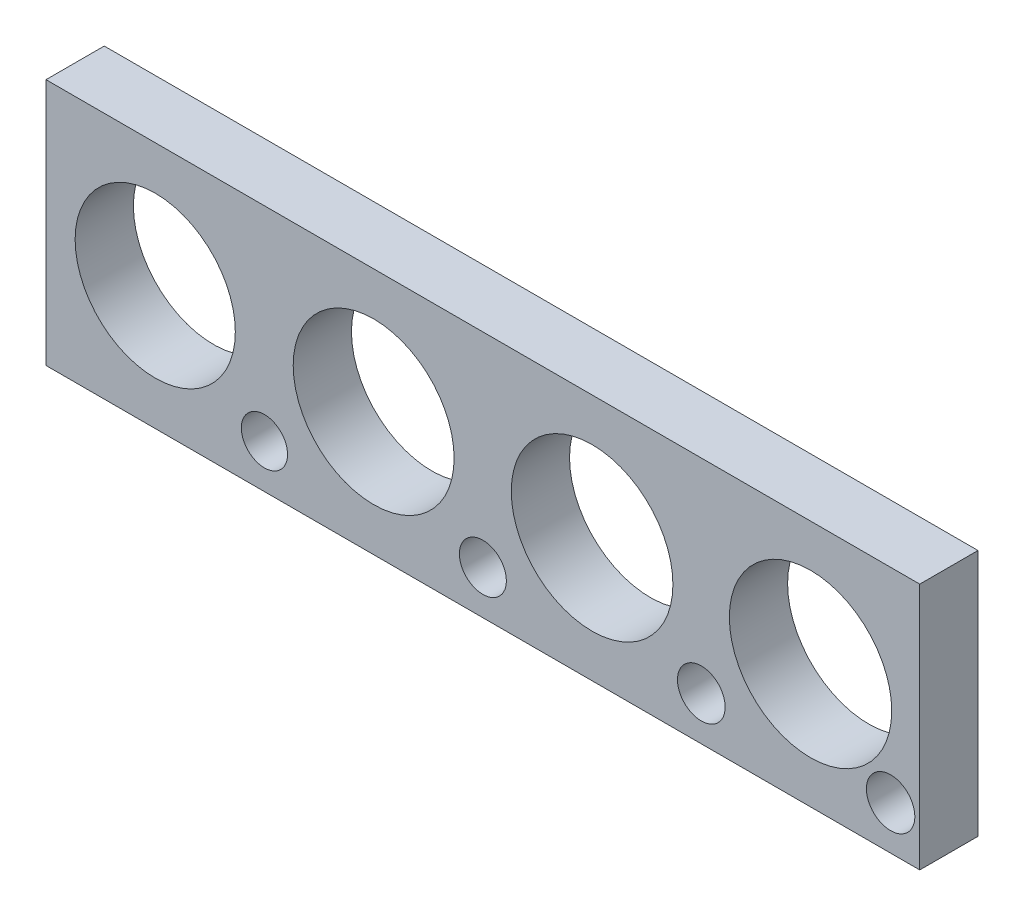
ISO-10303-21;
HEADER;
FILE_DESCRIPTION(('STEP AP214'),'2;1');
FILE_NAME('part.step','',(''),(''),'','','');
FILE_SCHEMA(('AUTOMOTIVE_DESIGN { 1 0 10303 214 1 1 1 1 }'));
ENDSEC;
DATA;
#1=APPLICATION_CONTEXT('core data for automotive mechanical design processes');
#2=APPLICATION_PROTOCOL_DEFINITION('international standard','automotive_design',2000,#1);
#3=PRODUCT_CONTEXT('',#1,'mechanical');
#4=PRODUCT('Part','Part','',(#3));
#5=PRODUCT_RELATED_PRODUCT_CATEGORY('part','',(#4));
#6=PRODUCT_DEFINITION_FORMATION('','',#4);
#7=PRODUCT_DEFINITION_CONTEXT('part definition',#1,'design');
#8=PRODUCT_DEFINITION('design','',#6,#7);
#9=PRODUCT_DEFINITION_SHAPE('','',#8);
#10=(LENGTH_UNIT() NAMED_UNIT(*) SI_UNIT(.MILLI.,.METRE.));
#11=(NAMED_UNIT(*) PLANE_ANGLE_UNIT() SI_UNIT($,.RADIAN.));
#12=(NAMED_UNIT(*) SI_UNIT($,.STERADIAN.) SOLID_ANGLE_UNIT());
#13=UNCERTAINTY_MEASURE_WITH_UNIT(LENGTH_MEASURE(1.E-05),#10,'distance_accuracy_value','');
#14=(GEOMETRIC_REPRESENTATION_CONTEXT(3) GLOBAL_UNCERTAINTY_ASSIGNED_CONTEXT((#13)) GLOBAL_UNIT_ASSIGNED_CONTEXT((#10,
#11,#12)) REPRESENTATION_CONTEXT('',''));
#15=CARTESIAN_POINT('',(0.,0.,0.));
#16=DIRECTION('',(0.,0.,1.));
#17=DIRECTION('',(1.,0.,0.));
#18=AXIS2_PLACEMENT_3D('',#15,#16,#17);
#19=CARTESIAN_POINT('',(-60.,-17.,8.));
#20=DIRECTION('',(1.,0.,0.));
#21=DIRECTION('',(0.,0.,-1.));
#22=AXIS2_PLACEMENT_3D('',#19,#20,#21);
#23=PLANE('',#22);
#24=DIRECTION('',(0.,-1.,0.));
#25=VECTOR('',#24,1.);
#26=CARTESIAN_POINT('',(-60.,-17.,0.));
#27=LINE('',#26,#25);
#28=CARTESIAN_POINT('',(-60.,17.,0.));
#29=VERTEX_POINT('',#28);
#30=CARTESIAN_POINT('',(-60.,-17.,0.));
#31=VERTEX_POINT('',#30);
#32=EDGE_CURVE('E117',#29,#31,#27,.T.);
#33=ORIENTED_EDGE('',*,*,#32,.T.);
#34=DIRECTION('',(0.,0.,-1.));
#35=VECTOR('',#34,1.);
#36=CARTESIAN_POINT('',(-60.,-17.,8.));
#37=LINE('',#36,#35);
#38=CARTESIAN_POINT('',(-60.,-17.,8.));
#39=VERTEX_POINT('',#38);
#40=EDGE_CURVE('E11',#39,#31,#37,.T.);
#41=ORIENTED_EDGE('',*,*,#40,.F.);
#42=DIRECTION('',(0.,-1.,0.));
#43=VECTOR('',#42,1.);
#44=CARTESIAN_POINT('',(-60.,-17.,8.));
#45=LINE('',#44,#43);
#46=CARTESIAN_POINT('',(-60.,17.,8.));
#47=VERTEX_POINT('',#46);
#48=EDGE_CURVE('E97',#47,#39,#45,.T.);
#49=ORIENTED_EDGE('',*,*,#48,.F.);
#50=DIRECTION('',(0.,0.,-1.));
#51=VECTOR('',#50,1.);
#52=CARTESIAN_POINT('',(-60.,17.,8.));
#53=LINE('',#52,#51);
#54=EDGE_CURVE('E115',#47,#29,#53,.T.);
#55=ORIENTED_EDGE('',*,*,#54,.T.);
#56=EDGE_LOOP('',(#33,#41,#49,#55));
#57=FACE_BOUND('',#56,.T.);
#58=ADVANCED_FACE('F44',(#57),#23,.F.);
#59=CARTESIAN_POINT('',(-60.,-17.,8.));
#60=DIRECTION('',(0.,1.,0.));
#61=DIRECTION('',(0.,0.,1.));
#62=AXIS2_PLACEMENT_3D('',#59,#60,#61);
#63=PLANE('',#62);
#64=DIRECTION('',(1.,0.,0.));
#65=VECTOR('',#64,1.);
#66=CARTESIAN_POINT('',(-60.,-17.,0.));
#67=LINE('',#66,#65);
#68=CARTESIAN_POINT('',(60.,-17.,0.));
#69=VERTEX_POINT('',#68);
#70=EDGE_CURVE('E102',#31,#69,#67,.T.);
#71=ORIENTED_EDGE('',*,*,#70,.T.);
#72=DIRECTION('',(0.,0.,-1.));
#73=VECTOR('',#72,1.);
#74=CARTESIAN_POINT('',(60.,-17.,8.));
#75=LINE('',#74,#73);
#76=CARTESIAN_POINT('',(60.,-17.,8.));
#77=VERTEX_POINT('',#76);
#78=EDGE_CURVE('E54',#77,#69,#75,.T.);
#79=ORIENTED_EDGE('',*,*,#78,.F.);
#80=DIRECTION('',(1.,0.,0.));
#81=VECTOR('',#80,1.);
#82=CARTESIAN_POINT('',(-60.,-17.,8.));
#83=LINE('',#82,#81);
#84=EDGE_CURVE('E94',#39,#77,#83,.T.);
#85=ORIENTED_EDGE('',*,*,#84,.F.);
#86=ORIENTED_EDGE('',*,*,#40,.T.);
#87=EDGE_LOOP('',(#71,#79,#85,#86));
#88=FACE_BOUND('',#87,.T.);
#89=ADVANCED_FACE('F103',(#88),#63,.F.);
#90=CARTESIAN_POINT('',(60.,-17.,8.));
#91=DIRECTION('',(-1.,0.,0.));
#92=DIRECTION('',(0.,0.,1.));
#93=AXIS2_PLACEMENT_3D('',#90,#91,#92);
#94=PLANE('',#93);
#95=DIRECTION('',(0.,1.,0.));
#96=VECTOR('',#95,1.);
#97=CARTESIAN_POINT('',(60.,-17.,0.));
#98=LINE('',#97,#96);
#99=CARTESIAN_POINT('',(60.,17.,0.));
#100=VERTEX_POINT('',#99);
#101=EDGE_CURVE('E81',#69,#100,#98,.T.);
#102=ORIENTED_EDGE('',*,*,#101,.T.);
#103=DIRECTION('',(0.,0.,-1.));
#104=VECTOR('',#103,1.);
#105=CARTESIAN_POINT('',(60.,17.,8.));
#106=LINE('',#105,#104);
#107=CARTESIAN_POINT('',(60.,17.,8.));
#108=VERTEX_POINT('',#107);
#109=EDGE_CURVE('E106',#108,#100,#106,.T.);
#110=ORIENTED_EDGE('',*,*,#109,.F.);
#111=DIRECTION('',(0.,1.,0.));
#112=VECTOR('',#111,1.);
#113=CARTESIAN_POINT('',(60.,-17.,8.));
#114=LINE('',#113,#112);
#115=EDGE_CURVE('E100',#77,#108,#114,.T.);
#116=ORIENTED_EDGE('',*,*,#115,.F.);
#117=ORIENTED_EDGE('',*,*,#78,.T.);
#118=EDGE_LOOP('',(#102,#110,#116,#117));
#119=FACE_BOUND('',#118,.T.);
#120=ADVANCED_FACE('F107',(#119),#94,.F.);
#121=CARTESIAN_POINT('',(-60.,17.,8.));
#122=DIRECTION('',(0.,-1.,0.));
#123=DIRECTION('',(0.,0.,-1.));
#124=AXIS2_PLACEMENT_3D('',#121,#122,#123);
#125=PLANE('',#124);
#126=DIRECTION('',(-1.,0.,0.));
#127=VECTOR('',#126,1.);
#128=CARTESIAN_POINT('',(-60.,17.,0.));
#129=LINE('',#128,#127);
#130=EDGE_CURVE('E87',#100,#29,#129,.T.);
#131=ORIENTED_EDGE('',*,*,#130,.T.);
#132=ORIENTED_EDGE('',*,*,#54,.F.);
#133=DIRECTION('',(-1.,0.,0.));
#134=VECTOR('',#133,1.);
#135=CARTESIAN_POINT('',(-60.,17.,8.));
#136=LINE('',#135,#134);
#137=EDGE_CURVE('E61',#108,#47,#136,.T.);
#138=ORIENTED_EDGE('',*,*,#137,.F.);
#139=ORIENTED_EDGE('',*,*,#109,.T.);
#140=EDGE_LOOP('',(#131,#132,#138,#139));
#141=FACE_BOUND('',#140,.T.);
#142=ADVANCED_FACE('F206',(#141),#125,.F.);
#143=CARTESIAN_POINT('',(0.,0.,8.));
#144=DIRECTION('',(0.,0.,-1.));
#145=DIRECTION('',(-1.,0.,0.));
#146=AXIS2_PLACEMENT_3D('',#143,#144,#145);
#147=PLANE('',#146);
#148=CARTESIAN_POINT('',(-30.,-11.,8.));
#149=DIRECTION('',(0.,0.,1.));
#150=DIRECTION('',(1.,0.,0.));
#151=AXIS2_PLACEMENT_3D('',#148,#149,#150);
#152=CIRCLE('',#151,3.175);
#153=CARTESIAN_POINT('',(-26.825,-11.,8.));
#154=VERTEX_POINT('',#153);
#155=EDGE_CURVE('E155',#154,#154,#152,.T.);
#156=ORIENTED_EDGE('',*,*,#155,.F.);
#157=EDGE_LOOP('',(#156));
#158=FACE_BOUND('',#157,.T.);
#159=CARTESIAN_POINT('',(0.,-11.,8.));
#160=DIRECTION('',(0.,0.,1.));
#161=DIRECTION('',(1.,0.,0.));
#162=AXIS2_PLACEMENT_3D('',#159,#160,#161);
#163=CIRCLE('',#162,3.225);
#164=CARTESIAN_POINT('',(3.225,-11.,8.));
#165=VERTEX_POINT('',#164);
#166=EDGE_CURVE('E192',#165,#165,#163,.T.);
#167=ORIENTED_EDGE('',*,*,#166,.F.);
#168=EDGE_LOOP('',(#167));
#169=FACE_BOUND('',#168,.T.);
#170=CARTESIAN_POINT('',(30.,-11.,8.));
#171=DIRECTION('',(0.,0.,1.));
#172=DIRECTION('',(1.,0.,0.));
#173=AXIS2_PLACEMENT_3D('',#170,#171,#172);
#174=CIRCLE('',#173,3.275);
#175=CARTESIAN_POINT('',(33.275,-11.,8.));
#176=VERTEX_POINT('',#175);
#177=EDGE_CURVE('E186',#176,#176,#174,.T.);
#178=ORIENTED_EDGE('',*,*,#177,.F.);
#179=EDGE_LOOP('',(#178));
#180=FACE_BOUND('',#179,.T.);
#181=CARTESIAN_POINT('',(56.,-11.,8.));
#182=DIRECTION('',(0.,0.,1.));
#183=DIRECTION('',(1.,0.,0.));
#184=AXIS2_PLACEMENT_3D('',#181,#182,#183);
#185=CIRCLE('',#184,3.325);
#186=CARTESIAN_POINT('',(59.325,-11.,8.));
#187=VERTEX_POINT('',#186);
#188=EDGE_CURVE('E183',#187,#187,#185,.T.);
#189=ORIENTED_EDGE('',*,*,#188,.F.);
#190=EDGE_LOOP('',(#189));
#191=FACE_BOUND('',#190,.T.);
#192=CARTESIAN_POINT('',(-45.,0.,8.));
#193=DIRECTION('',(0.,0.,1.));
#194=DIRECTION('',(1.,0.,0.));
#195=AXIS2_PLACEMENT_3D('',#192,#193,#194);
#196=CIRCLE('',#195,11.);
#197=CARTESIAN_POINT('',(-34.,0.,8.));
#198=VERTEX_POINT('',#197);
#199=EDGE_CURVE('E136',#198,#198,#196,.T.);
#200=ORIENTED_EDGE('',*,*,#199,.F.);
#201=EDGE_LOOP('',(#200));
#202=FACE_BOUND('',#201,.T.);
#203=CARTESIAN_POINT('',(-15.,0.,8.));
#204=DIRECTION('',(0.,0.,1.));
#205=DIRECTION('',(1.,0.,0.));
#206=AXIS2_PLACEMENT_3D('',#203,#204,#205);
#207=CIRCLE('',#206,11.05);
#208=CARTESIAN_POINT('',(-3.95,0.,8.));
#209=VERTEX_POINT('',#208);
#210=EDGE_CURVE('E174',#209,#209,#207,.T.);
#211=ORIENTED_EDGE('',*,*,#210,.F.);
#212=EDGE_LOOP('',(#211));
#213=FACE_BOUND('',#212,.T.);
#214=CARTESIAN_POINT('',(15.,0.,8.));
#215=DIRECTION('',(0.,0.,1.));
#216=DIRECTION('',(1.,0.,0.));
#217=AXIS2_PLACEMENT_3D('',#214,#215,#216);
#218=CIRCLE('',#217,11.1);
#219=CARTESIAN_POINT('',(26.1,0.,8.));
#220=VERTEX_POINT('',#219);
#221=EDGE_CURVE('E170',#220,#220,#218,.T.);
#222=ORIENTED_EDGE('',*,*,#221,.F.);
#223=EDGE_LOOP('',(#222));
#224=FACE_BOUND('',#223,.T.);
#225=CARTESIAN_POINT('',(45.,0.,8.));
#226=DIRECTION('',(0.,0.,1.));
#227=DIRECTION('',(1.,0.,0.));
#228=AXIS2_PLACEMENT_3D('',#225,#226,#227);
#229=CIRCLE('',#228,11.15);
#230=CARTESIAN_POINT('',(56.15,0.,8.));
#231=VERTEX_POINT('',#230);
#232=EDGE_CURVE('E165',#231,#231,#229,.T.);
#233=ORIENTED_EDGE('',*,*,#232,.F.);
#234=EDGE_LOOP('',(#233));
#235=FACE_BOUND('',#234,.T.);
#236=ORIENTED_EDGE('',*,*,#48,.T.);
#237=ORIENTED_EDGE('',*,*,#84,.T.);
#238=ORIENTED_EDGE('',*,*,#115,.T.);
#239=ORIENTED_EDGE('',*,*,#137,.T.);
#240=EDGE_LOOP('',(#236,#237,#238,#239));
#241=FACE_BOUND('',#240,.T.);
#242=ADVANCED_FACE('F92',(#158,#169,#180,#191,#202,#213,#224,#235,#241),#147,.F.);
#243=CARTESIAN_POINT('',(0.,0.,0.));
#244=DIRECTION('',(0.,0.,-1.));
#245=DIRECTION('',(-1.,0.,0.));
#246=AXIS2_PLACEMENT_3D('',#243,#244,#245);
#247=PLANE('',#246);
#248=CARTESIAN_POINT('',(-30.,-11.,0.));
#249=DIRECTION('',(0.,0.,-1.));
#250=DIRECTION('',(-1.,0.,0.));
#251=AXIS2_PLACEMENT_3D('',#248,#249,#250);
#252=CIRCLE('',#251,3.175);
#253=CARTESIAN_POINT('',(-33.175,-11.,0.));
#254=VERTEX_POINT('',#253);
#255=EDGE_CURVE('E48',#254,#254,#252,.F.);
#256=ORIENTED_EDGE('',*,*,#255,.T.);
#257=EDGE_LOOP('',(#256));
#258=FACE_BOUND('',#257,.T.);
#259=CARTESIAN_POINT('',(0.,-11.,0.));
#260=DIRECTION('',(0.,0.,-1.));
#261=DIRECTION('',(-1.,0.,0.));
#262=AXIS2_PLACEMENT_3D('',#259,#260,#261);
#263=CIRCLE('',#262,3.225);
#264=CARTESIAN_POINT('',(-3.225,-11.,0.));
#265=VERTEX_POINT('',#264);
#266=EDGE_CURVE('E154',#265,#265,#263,.F.);
#267=ORIENTED_EDGE('',*,*,#266,.T.);
#268=EDGE_LOOP('',(#267));
#269=FACE_BOUND('',#268,.T.);
#270=CARTESIAN_POINT('',(30.,-11.,0.));
#271=DIRECTION('',(0.,0.,-1.));
#272=DIRECTION('',(-1.,0.,0.));
#273=AXIS2_PLACEMENT_3D('',#270,#271,#272);
#274=CIRCLE('',#273,3.275);
#275=CARTESIAN_POINT('',(26.725,-11.,0.));
#276=VERTEX_POINT('',#275);
#277=EDGE_CURVE('E151',#276,#276,#274,.F.);
#278=ORIENTED_EDGE('',*,*,#277,.T.);
#279=EDGE_LOOP('',(#278));
#280=FACE_BOUND('',#279,.T.);
#281=CARTESIAN_POINT('',(56.,-11.,0.));
#282=DIRECTION('',(0.,0.,-1.));
#283=DIRECTION('',(-1.,0.,0.));
#284=AXIS2_PLACEMENT_3D('',#281,#282,#283);
#285=CIRCLE('',#284,3.325);
#286=CARTESIAN_POINT('',(52.675,-11.,0.));
#287=VERTEX_POINT('',#286);
#288=EDGE_CURVE('E150',#287,#287,#285,.F.);
#289=ORIENTED_EDGE('',*,*,#288,.T.);
#290=EDGE_LOOP('',(#289));
#291=FACE_BOUND('',#290,.T.);
#292=CARTESIAN_POINT('',(-45.,0.,0.));
#293=DIRECTION('',(0.,0.,-1.));
#294=DIRECTION('',(-1.,0.,0.));
#295=AXIS2_PLACEMENT_3D('',#292,#293,#294);
#296=CIRCLE('',#295,11.);
#297=CARTESIAN_POINT('',(-56.,0.,0.));
#298=VERTEX_POINT('',#297);
#299=EDGE_CURVE('E118',#298,#298,#296,.F.);
#300=ORIENTED_EDGE('',*,*,#299,.T.);
#301=EDGE_LOOP('',(#300));
#302=FACE_BOUND('',#301,.T.);
#303=CARTESIAN_POINT('',(-15.,0.,0.));
#304=DIRECTION('',(0.,0.,-1.));
#305=DIRECTION('',(-1.,0.,0.));
#306=AXIS2_PLACEMENT_3D('',#303,#304,#305);
#307=CIRCLE('',#306,11.05);
#308=CARTESIAN_POINT('',(-26.05,0.,0.));
#309=VERTEX_POINT('',#308);
#310=EDGE_CURVE('E139',#309,#309,#307,.F.);
#311=ORIENTED_EDGE('',*,*,#310,.T.);
#312=EDGE_LOOP('',(#311));
#313=FACE_BOUND('',#312,.T.);
#314=CARTESIAN_POINT('',(15.,0.,0.));
#315=DIRECTION('',(0.,0.,-1.));
#316=DIRECTION('',(-1.,0.,0.));
#317=AXIS2_PLACEMENT_3D('',#314,#315,#316);
#318=CIRCLE('',#317,11.1);
#319=CARTESIAN_POINT('',(3.9,0.,0.));
#320=VERTEX_POINT('',#319);
#321=EDGE_CURVE('E133',#320,#320,#318,.F.);
#322=ORIENTED_EDGE('',*,*,#321,.T.);
#323=EDGE_LOOP('',(#322));
#324=FACE_BOUND('',#323,.T.);
#325=CARTESIAN_POINT('',(45.,0.,0.));
#326=DIRECTION('',(0.,0.,-1.));
#327=DIRECTION('',(-1.,0.,0.));
#328=AXIS2_PLACEMENT_3D('',#325,#326,#327);
#329=CIRCLE('',#328,11.15);
#330=CARTESIAN_POINT('',(33.85,0.,0.));
#331=VERTEX_POINT('',#330);
#332=EDGE_CURVE('E132',#331,#331,#329,.F.);
#333=ORIENTED_EDGE('',*,*,#332,.T.);
#334=EDGE_LOOP('',(#333));
#335=FACE_BOUND('',#334,.T.);
#336=ORIENTED_EDGE('',*,*,#32,.F.);
#337=ORIENTED_EDGE('',*,*,#130,.F.);
#338=ORIENTED_EDGE('',*,*,#101,.F.);
#339=ORIENTED_EDGE('',*,*,#70,.F.);
#340=EDGE_LOOP('',(#336,#337,#338,#339));
#341=FACE_BOUND('',#340,.T.);
#342=ADVANCED_FACE('F202',(#258,#269,#280,#291,#302,#313,#324,#335,#341),#247,.T.);
#343=CARTESIAN_POINT('',(45.,0.,8.));
#344=DIRECTION('',(0.,0.,-1.));
#345=DIRECTION('',(-1.,0.,0.));
#346=AXIS2_PLACEMENT_3D('',#343,#344,#345);
#347=CYLINDRICAL_SURFACE('',#346,11.15);
#348=ORIENTED_EDGE('',*,*,#332,.F.);
#349=EDGE_LOOP('',(#348));
#350=FACE_BOUND('',#349,.T.);
#351=ORIENTED_EDGE('',*,*,#232,.T.);
#352=EDGE_LOOP('',(#351));
#353=FACE_BOUND('',#352,.T.);
#354=ADVANCED_FACE('F224',(#350,#353),#347,.F.);
#355=CARTESIAN_POINT('',(15.,0.,8.));
#356=DIRECTION('',(0.,0.,-1.));
#357=DIRECTION('',(-1.,0.,0.));
#358=AXIS2_PLACEMENT_3D('',#355,#356,#357);
#359=CYLINDRICAL_SURFACE('',#358,11.1);
#360=ORIENTED_EDGE('',*,*,#321,.F.);
#361=EDGE_LOOP('',(#360));
#362=FACE_BOUND('',#361,.T.);
#363=ORIENTED_EDGE('',*,*,#221,.T.);
#364=EDGE_LOOP('',(#363));
#365=FACE_BOUND('',#364,.T.);
#366=ADVANCED_FACE('F219',(#362,#365),#359,.F.);
#367=CARTESIAN_POINT('',(-15.,0.,8.));
#368=DIRECTION('',(0.,0.,-1.));
#369=DIRECTION('',(-1.,0.,0.));
#370=AXIS2_PLACEMENT_3D('',#367,#368,#369);
#371=CYLINDRICAL_SURFACE('',#370,11.05);
#372=ORIENTED_EDGE('',*,*,#310,.F.);
#373=EDGE_LOOP('',(#372));
#374=FACE_BOUND('',#373,.T.);
#375=ORIENTED_EDGE('',*,*,#210,.T.);
#376=EDGE_LOOP('',(#375));
#377=FACE_BOUND('',#376,.T.);
#378=ADVANCED_FACE('F225',(#374,#377),#371,.F.);
#379=CARTESIAN_POINT('',(-45.,0.,8.));
#380=DIRECTION('',(0.,0.,-1.));
#381=DIRECTION('',(-1.,0.,0.));
#382=AXIS2_PLACEMENT_3D('',#379,#380,#381);
#383=CYLINDRICAL_SURFACE('',#382,11.);
#384=ORIENTED_EDGE('',*,*,#299,.F.);
#385=EDGE_LOOP('',(#384));
#386=FACE_BOUND('',#385,.T.);
#387=ORIENTED_EDGE('',*,*,#199,.T.);
#388=EDGE_LOOP('',(#387));
#389=FACE_BOUND('',#388,.T.);
#390=ADVANCED_FACE('F228',(#386,#389),#383,.F.);
#391=CARTESIAN_POINT('',(56.,-11.,8.));
#392=DIRECTION('',(0.,0.,-1.));
#393=DIRECTION('',(-1.,0.,0.));
#394=AXIS2_PLACEMENT_3D('',#391,#392,#393);
#395=CYLINDRICAL_SURFACE('',#394,3.325);
#396=ORIENTED_EDGE('',*,*,#288,.F.);
#397=EDGE_LOOP('',(#396));
#398=FACE_BOUND('',#397,.T.);
#399=ORIENTED_EDGE('',*,*,#188,.T.);
#400=EDGE_LOOP('',(#399));
#401=FACE_BOUND('',#400,.T.);
#402=ADVANCED_FACE('F289',(#398,#401),#395,.F.);
#403=CARTESIAN_POINT('',(30.,-11.,8.));
#404=DIRECTION('',(0.,0.,-1.));
#405=DIRECTION('',(-1.,0.,0.));
#406=AXIS2_PLACEMENT_3D('',#403,#404,#405);
#407=CYLINDRICAL_SURFACE('',#406,3.275);
#408=ORIENTED_EDGE('',*,*,#277,.F.);
#409=EDGE_LOOP('',(#408));
#410=FACE_BOUND('',#409,.T.);
#411=ORIENTED_EDGE('',*,*,#177,.T.);
#412=EDGE_LOOP('',(#411));
#413=FACE_BOUND('',#412,.T.);
#414=ADVANCED_FACE('F296',(#410,#413),#407,.F.);
#415=CARTESIAN_POINT('',(0.,-11.,8.));
#416=DIRECTION('',(0.,0.,-1.));
#417=DIRECTION('',(-1.,0.,0.));
#418=AXIS2_PLACEMENT_3D('',#415,#416,#417);
#419=CYLINDRICAL_SURFACE('',#418,3.225);
#420=ORIENTED_EDGE('',*,*,#266,.F.);
#421=EDGE_LOOP('',(#420));
#422=FACE_BOUND('',#421,.T.);
#423=ORIENTED_EDGE('',*,*,#166,.T.);
#424=EDGE_LOOP('',(#423));
#425=FACE_BOUND('',#424,.T.);
#426=ADVANCED_FACE('F310',(#422,#425),#419,.F.);
#427=CARTESIAN_POINT('',(-30.,-11.,8.));
#428=DIRECTION('',(0.,0.,-1.));
#429=DIRECTION('',(-1.,0.,0.));
#430=AXIS2_PLACEMENT_3D('',#427,#428,#429);
#431=CYLINDRICAL_SURFACE('',#430,3.175);
#432=ORIENTED_EDGE('',*,*,#255,.F.);
#433=EDGE_LOOP('',(#432));
#434=FACE_BOUND('',#433,.T.);
#435=ORIENTED_EDGE('',*,*,#155,.T.);
#436=EDGE_LOOP('',(#435));
#437=FACE_BOUND('',#436,.T.);
#438=ADVANCED_FACE('F203',(#434,#437),#431,.F.);
#439=CLOSED_SHELL('',(#58,#89,#120,#142,#242,#342,#354,#366,#378,#390,#402,#414,#426,#438));
#440=MANIFOLD_SOLID_BREP('B2',#439);
#441=ADVANCED_BREP_SHAPE_REPRESENTATION('',(#18,#440),#14);
#442=SHAPE_DEFINITION_REPRESENTATION(#9,#441);
ENDSEC;
END-ISO-10303-21;
